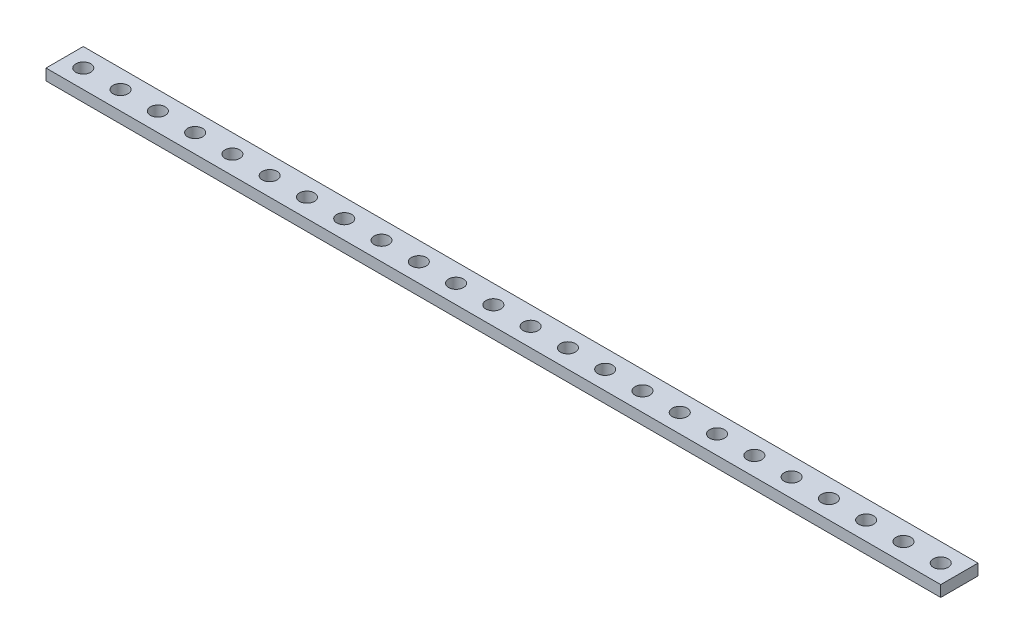
ISO-10303-21;
HEADER;
FILE_DESCRIPTION(('STEP AP214'),'2;1');
FILE_NAME('part.step','',(''),(''),'','','');
FILE_SCHEMA(('AUTOMOTIVE_DESIGN { 1 0 10303 214 1 1 1 1 }'));
ENDSEC;
DATA;
#1=APPLICATION_CONTEXT('core data for automotive mechanical design processes');
#2=APPLICATION_PROTOCOL_DEFINITION('international standard','automotive_design',2000,#1);
#3=PRODUCT_CONTEXT('',#1,'mechanical');
#4=PRODUCT('Part','Part','',(#3));
#5=PRODUCT_RELATED_PRODUCT_CATEGORY('part','',(#4));
#6=PRODUCT_DEFINITION_FORMATION('','',#4);
#7=PRODUCT_DEFINITION_CONTEXT('part definition',#1,'design');
#8=PRODUCT_DEFINITION('design','',#6,#7);
#9=PRODUCT_DEFINITION_SHAPE('','',#8);
#10=(LENGTH_UNIT() NAMED_UNIT(*) SI_UNIT(.MILLI.,.METRE.));
#11=(NAMED_UNIT(*) PLANE_ANGLE_UNIT() SI_UNIT($,.RADIAN.));
#12=(NAMED_UNIT(*) SI_UNIT($,.STERADIAN.) SOLID_ANGLE_UNIT());
#13=UNCERTAINTY_MEASURE_WITH_UNIT(LENGTH_MEASURE(1.E-05),#10,'distance_accuracy_value','');
#14=(GEOMETRIC_REPRESENTATION_CONTEXT(3) GLOBAL_UNCERTAINTY_ASSIGNED_CONTEXT((#13)) GLOBAL_UNIT_ASSIGNED_CONTEXT((#10,
#11,#12)) REPRESENTATION_CONTEXT('',''));
#15=CARTESIAN_POINT('',(0.,0.,0.));
#16=DIRECTION('',(0.,0.,1.));
#17=DIRECTION('',(1.,0.,0.));
#18=AXIS2_PLACEMENT_3D('',#15,#16,#17);
#19=CARTESIAN_POINT('',(0.,3.,0.));
#20=DIRECTION('',(0.,-1.,0.));
#21=DIRECTION('',(0.,0.,-1.));
#22=AXIS2_PLACEMENT_3D('',#19,#20,#21);
#23=PLANE('',#22);
#24=DIRECTION('',(1.,0.,0.));
#25=VECTOR('',#24,1.);
#26=CARTESIAN_POINT('',(0.,3.,0.));
#27=LINE('',#26,#25);
#28=CARTESIAN_POINT('',(-140.,3.,0.));
#29=VERTEX_POINT('',#28);
#30=CARTESIAN_POINT('',(100.,3.,0.));
#31=VERTEX_POINT('',#30);
#32=EDGE_CURVE('E89',#29,#31,#27,.T.);
#33=ORIENTED_EDGE('',*,*,#32,.T.);
#34=DIRECTION('',(0.,0.,1.));
#35=VECTOR('',#34,1.);
#36=CARTESIAN_POINT('',(100.,3.,-10.));
#37=LINE('',#36,#35);
#38=CARTESIAN_POINT('',(100.,3.,-10.));
#39=VERTEX_POINT('',#38);
#40=EDGE_CURVE('E244',#39,#31,#37,.T.);
#41=ORIENTED_EDGE('',*,*,#40,.F.);
#42=DIRECTION('',(-1.,0.,0.));
#43=VECTOR('',#42,1.);
#44=CARTESIAN_POINT('',(-140.,3.,-9.99999999999998));
#45=LINE('',#44,#43);
#46=CARTESIAN_POINT('',(-140.,3.,-9.99999999999998));
#47=VERTEX_POINT('',#46);
#48=EDGE_CURVE('E91',#39,#47,#45,.T.);
#49=ORIENTED_EDGE('',*,*,#48,.T.);
#50=DIRECTION('',(0.,0.,1.));
#51=VECTOR('',#50,1.);
#52=CARTESIAN_POINT('',(-140.,3.,0.));
#53=LINE('',#52,#51);
#54=EDGE_CURVE('E60',#47,#29,#53,.T.);
#55=ORIENTED_EDGE('',*,*,#54,.T.);
#56=EDGE_LOOP('',(#33,#41,#49,#55));
#57=FACE_BOUND('',#56,.T.);
#58=CARTESIAN_POINT('',(-135.,3.,-4.99999999999998));
#59=DIRECTION('',(0.,1.,0.));
#60=DIRECTION('',(0.,0.,1.));
#61=AXIS2_PLACEMENT_3D('',#58,#59,#60);
#62=CIRCLE('',#61,2.);
#63=CARTESIAN_POINT('',(-135.,3.,-2.99999999999999));
#64=VERTEX_POINT('',#63);
#65=EDGE_CURVE('E83',#64,#64,#62,.T.);
#66=ORIENTED_EDGE('',*,*,#65,.F.);
#67=EDGE_LOOP('',(#66));
#68=FACE_BOUND('',#67,.T.);
#69=CARTESIAN_POINT('',(-125.,3.,-4.99999999999998));
#70=DIRECTION('',(0.,1.,0.));
#71=DIRECTION('',(0.,0.,1.));
#72=AXIS2_PLACEMENT_3D('',#69,#70,#71);
#73=CIRCLE('',#72,1.99999999999998);
#74=CARTESIAN_POINT('',(-125.,3.,-3.));
#75=VERTEX_POINT('',#74);
#76=EDGE_CURVE('E100',#75,#75,#73,.T.);
#77=ORIENTED_EDGE('',*,*,#76,.F.);
#78=EDGE_LOOP('',(#77));
#79=FACE_BOUND('',#78,.T.);
#80=CARTESIAN_POINT('',(-115.,3.,-4.99999999999998));
#81=DIRECTION('',(0.,1.,0.));
#82=DIRECTION('',(0.,0.,1.));
#83=AXIS2_PLACEMENT_3D('',#80,#81,#82);
#84=CIRCLE('',#83,2.);
#85=CARTESIAN_POINT('',(-115.,3.,-2.99999999999999));
#86=VERTEX_POINT('',#85);
#87=EDGE_CURVE('E106',#86,#86,#84,.T.);
#88=ORIENTED_EDGE('',*,*,#87,.F.);
#89=EDGE_LOOP('',(#88));
#90=FACE_BOUND('',#89,.T.);
#91=CARTESIAN_POINT('',(-105.,3.,-4.99999999999998));
#92=DIRECTION('',(0.,1.,0.));
#93=DIRECTION('',(0.,0.,1.));
#94=AXIS2_PLACEMENT_3D('',#91,#92,#93);
#95=CIRCLE('',#94,2.);
#96=CARTESIAN_POINT('',(-105.,3.,-2.99999999999999));
#97=VERTEX_POINT('',#96);
#98=EDGE_CURVE('E112',#97,#97,#95,.T.);
#99=ORIENTED_EDGE('',*,*,#98,.F.);
#100=EDGE_LOOP('',(#99));
#101=FACE_BOUND('',#100,.T.);
#102=CARTESIAN_POINT('',(-95.,3.,-4.99999999999998));
#103=DIRECTION('',(0.,1.,0.));
#104=DIRECTION('',(0.,0.,1.));
#105=AXIS2_PLACEMENT_3D('',#102,#103,#104);
#106=CIRCLE('',#105,2.);
#107=CARTESIAN_POINT('',(-95.,3.,-2.99999999999999));
#108=VERTEX_POINT('',#107);
#109=EDGE_CURVE('E118',#108,#108,#106,.T.);
#110=ORIENTED_EDGE('',*,*,#109,.F.);
#111=EDGE_LOOP('',(#110));
#112=FACE_BOUND('',#111,.T.);
#113=CARTESIAN_POINT('',(-85.,3.,-4.99999999999998));
#114=DIRECTION('',(0.,1.,0.));
#115=DIRECTION('',(0.,0.,1.));
#116=AXIS2_PLACEMENT_3D('',#113,#114,#115);
#117=CIRCLE('',#116,2.);
#118=CARTESIAN_POINT('',(-85.,3.,-2.99999999999999));
#119=VERTEX_POINT('',#118);
#120=EDGE_CURVE('E124',#119,#119,#117,.T.);
#121=ORIENTED_EDGE('',*,*,#120,.F.);
#122=EDGE_LOOP('',(#121));
#123=FACE_BOUND('',#122,.T.);
#124=CARTESIAN_POINT('',(-75.,3.,-4.99999999999998));
#125=DIRECTION('',(0.,1.,0.));
#126=DIRECTION('',(0.,0.,1.));
#127=AXIS2_PLACEMENT_3D('',#124,#125,#126);
#128=CIRCLE('',#127,2.);
#129=CARTESIAN_POINT('',(-75.,3.,-2.99999999999999));
#130=VERTEX_POINT('',#129);
#131=EDGE_CURVE('E130',#130,#130,#128,.T.);
#132=ORIENTED_EDGE('',*,*,#131,.F.);
#133=EDGE_LOOP('',(#132));
#134=FACE_BOUND('',#133,.T.);
#135=CARTESIAN_POINT('',(-65.,3.,-4.99999999999998));
#136=DIRECTION('',(0.,1.,0.));
#137=DIRECTION('',(0.,0.,1.));
#138=AXIS2_PLACEMENT_3D('',#135,#136,#137);
#139=CIRCLE('',#138,2.);
#140=CARTESIAN_POINT('',(-65.,3.,-2.99999999999999));
#141=VERTEX_POINT('',#140);
#142=EDGE_CURVE('E136',#141,#141,#139,.T.);
#143=ORIENTED_EDGE('',*,*,#142,.F.);
#144=EDGE_LOOP('',(#143));
#145=FACE_BOUND('',#144,.T.);
#146=CARTESIAN_POINT('',(-55.,3.,-4.99999999999998));
#147=DIRECTION('',(0.,1.,0.));
#148=DIRECTION('',(0.,0.,1.));
#149=AXIS2_PLACEMENT_3D('',#146,#147,#148);
#150=CIRCLE('',#149,2.);
#151=CARTESIAN_POINT('',(-55.,3.,-2.99999999999999));
#152=VERTEX_POINT('',#151);
#153=EDGE_CURVE('E142',#152,#152,#150,.T.);
#154=ORIENTED_EDGE('',*,*,#153,.F.);
#155=EDGE_LOOP('',(#154));
#156=FACE_BOUND('',#155,.T.);
#157=CARTESIAN_POINT('',(-45.,3.,-4.99999999999998));
#158=DIRECTION('',(0.,1.,0.));
#159=DIRECTION('',(0.,0.,1.));
#160=AXIS2_PLACEMENT_3D('',#157,#158,#159);
#161=CIRCLE('',#160,2.);
#162=CARTESIAN_POINT('',(-45.,3.,-2.99999999999999));
#163=VERTEX_POINT('',#162);
#164=EDGE_CURVE('E148',#163,#163,#161,.T.);
#165=ORIENTED_EDGE('',*,*,#164,.F.);
#166=EDGE_LOOP('',(#165));
#167=FACE_BOUND('',#166,.T.);
#168=CARTESIAN_POINT('',(-35.,3.,-4.99999999999998));
#169=DIRECTION('',(0.,1.,0.));
#170=DIRECTION('',(0.,0.,1.));
#171=AXIS2_PLACEMENT_3D('',#168,#169,#170);
#172=CIRCLE('',#171,2.);
#173=CARTESIAN_POINT('',(-35.,3.,-2.99999999999999));
#174=VERTEX_POINT('',#173);
#175=EDGE_CURVE('E154',#174,#174,#172,.T.);
#176=ORIENTED_EDGE('',*,*,#175,.F.);
#177=EDGE_LOOP('',(#176));
#178=FACE_BOUND('',#177,.T.);
#179=CARTESIAN_POINT('',(-25.,3.,-4.99999999999998));
#180=DIRECTION('',(0.,1.,0.));
#181=DIRECTION('',(0.,0.,1.));
#182=AXIS2_PLACEMENT_3D('',#179,#180,#181);
#183=CIRCLE('',#182,2.);
#184=CARTESIAN_POINT('',(-25.,3.,-2.99999999999999));
#185=VERTEX_POINT('',#184);
#186=EDGE_CURVE('E160',#185,#185,#183,.T.);
#187=ORIENTED_EDGE('',*,*,#186,.F.);
#188=EDGE_LOOP('',(#187));
#189=FACE_BOUND('',#188,.T.);
#190=CARTESIAN_POINT('',(-15.,3.,-4.99999999999998));
#191=DIRECTION('',(0.,1.,0.));
#192=DIRECTION('',(0.,0.,1.));
#193=AXIS2_PLACEMENT_3D('',#190,#191,#192);
#194=CIRCLE('',#193,2.);
#195=CARTESIAN_POINT('',(-15.,3.,-2.99999999999999));
#196=VERTEX_POINT('',#195);
#197=EDGE_CURVE('E166',#196,#196,#194,.T.);
#198=ORIENTED_EDGE('',*,*,#197,.F.);
#199=EDGE_LOOP('',(#198));
#200=FACE_BOUND('',#199,.T.);
#201=CARTESIAN_POINT('',(-5.,3.,-4.99999999999998));
#202=DIRECTION('',(0.,1.,0.));
#203=DIRECTION('',(0.,0.,1.));
#204=AXIS2_PLACEMENT_3D('',#201,#202,#203);
#205=CIRCLE('',#204,2.);
#206=CARTESIAN_POINT('',(-5.,3.,-2.99999999999999));
#207=VERTEX_POINT('',#206);
#208=EDGE_CURVE('E172',#207,#207,#205,.T.);
#209=ORIENTED_EDGE('',*,*,#208,.F.);
#210=EDGE_LOOP('',(#209));
#211=FACE_BOUND('',#210,.T.);
#212=CARTESIAN_POINT('',(5.,3.,-4.99999999999998));
#213=DIRECTION('',(0.,1.,0.));
#214=DIRECTION('',(0.,0.,1.));
#215=AXIS2_PLACEMENT_3D('',#212,#213,#214);
#216=CIRCLE('',#215,2.);
#217=CARTESIAN_POINT('',(5.,3.,-2.99999999999999));
#218=VERTEX_POINT('',#217);
#219=EDGE_CURVE('E178',#218,#218,#216,.T.);
#220=ORIENTED_EDGE('',*,*,#219,.F.);
#221=EDGE_LOOP('',(#220));
#222=FACE_BOUND('',#221,.T.);
#223=CARTESIAN_POINT('',(15.,3.,-4.99999999999998));
#224=DIRECTION('',(0.,1.,0.));
#225=DIRECTION('',(0.,0.,1.));
#226=AXIS2_PLACEMENT_3D('',#223,#224,#225);
#227=CIRCLE('',#226,2.);
#228=CARTESIAN_POINT('',(15.,3.,-2.99999999999999));
#229=VERTEX_POINT('',#228);
#230=EDGE_CURVE('E184',#229,#229,#227,.T.);
#231=ORIENTED_EDGE('',*,*,#230,.F.);
#232=EDGE_LOOP('',(#231));
#233=FACE_BOUND('',#232,.T.);
#234=CARTESIAN_POINT('',(25.,3.,-4.99999999999998));
#235=DIRECTION('',(0.,1.,0.));
#236=DIRECTION('',(0.,0.,1.));
#237=AXIS2_PLACEMENT_3D('',#234,#235,#236);
#238=CIRCLE('',#237,2.);
#239=CARTESIAN_POINT('',(25.,3.,-2.99999999999999));
#240=VERTEX_POINT('',#239);
#241=EDGE_CURVE('E190',#240,#240,#238,.T.);
#242=ORIENTED_EDGE('',*,*,#241,.F.);
#243=EDGE_LOOP('',(#242));
#244=FACE_BOUND('',#243,.T.);
#245=CARTESIAN_POINT('',(35.,3.,-4.99999999999998));
#246=DIRECTION('',(0.,1.,0.));
#247=DIRECTION('',(0.,0.,1.));
#248=AXIS2_PLACEMENT_3D('',#245,#246,#247);
#249=CIRCLE('',#248,2.);
#250=CARTESIAN_POINT('',(35.,3.,-2.99999999999999));
#251=VERTEX_POINT('',#250);
#252=EDGE_CURVE('E196',#251,#251,#249,.T.);
#253=ORIENTED_EDGE('',*,*,#252,.F.);
#254=EDGE_LOOP('',(#253));
#255=FACE_BOUND('',#254,.T.);
#256=CARTESIAN_POINT('',(45.,3.,-4.99999999999998));
#257=DIRECTION('',(0.,1.,0.));
#258=DIRECTION('',(0.,0.,1.));
#259=AXIS2_PLACEMENT_3D('',#256,#257,#258);
#260=CIRCLE('',#259,2.);
#261=CARTESIAN_POINT('',(45.,3.,-2.99999999999999));
#262=VERTEX_POINT('',#261);
#263=EDGE_CURVE('E202',#262,#262,#260,.T.);
#264=ORIENTED_EDGE('',*,*,#263,.F.);
#265=EDGE_LOOP('',(#264));
#266=FACE_BOUND('',#265,.T.);
#267=CARTESIAN_POINT('',(55.,3.,-4.99999999999998));
#268=DIRECTION('',(0.,1.,0.));
#269=DIRECTION('',(0.,0.,1.));
#270=AXIS2_PLACEMENT_3D('',#267,#268,#269);
#271=CIRCLE('',#270,2.);
#272=CARTESIAN_POINT('',(55.,3.,-2.99999999999999));
#273=VERTEX_POINT('',#272);
#274=EDGE_CURVE('E208',#273,#273,#271,.T.);
#275=ORIENTED_EDGE('',*,*,#274,.F.);
#276=EDGE_LOOP('',(#275));
#277=FACE_BOUND('',#276,.T.);
#278=CARTESIAN_POINT('',(65.,3.,-4.99999999999998));
#279=DIRECTION('',(0.,1.,0.));
#280=DIRECTION('',(0.,0.,1.));
#281=AXIS2_PLACEMENT_3D('',#278,#279,#280);
#282=CIRCLE('',#281,2.);
#283=CARTESIAN_POINT('',(65.,3.,-2.99999999999999));
#284=VERTEX_POINT('',#283);
#285=EDGE_CURVE('E214',#284,#284,#282,.T.);
#286=ORIENTED_EDGE('',*,*,#285,.F.);
#287=EDGE_LOOP('',(#286));
#288=FACE_BOUND('',#287,.T.);
#289=CARTESIAN_POINT('',(75.,3.,-4.99999999999998));
#290=DIRECTION('',(0.,1.,0.));
#291=DIRECTION('',(0.,0.,1.));
#292=AXIS2_PLACEMENT_3D('',#289,#290,#291);
#293=CIRCLE('',#292,2.);
#294=CARTESIAN_POINT('',(75.,3.,-2.99999999999999));
#295=VERTEX_POINT('',#294);
#296=EDGE_CURVE('E220',#295,#295,#293,.T.);
#297=ORIENTED_EDGE('',*,*,#296,.F.);
#298=EDGE_LOOP('',(#297));
#299=FACE_BOUND('',#298,.T.);
#300=CARTESIAN_POINT('',(85.,3.,-4.99999999999998));
#301=DIRECTION('',(0.,1.,0.));
#302=DIRECTION('',(0.,0.,1.));
#303=AXIS2_PLACEMENT_3D('',#300,#301,#302);
#304=CIRCLE('',#303,2.);
#305=CARTESIAN_POINT('',(85.,3.,-2.99999999999999));
#306=VERTEX_POINT('',#305);
#307=EDGE_CURVE('E226',#306,#306,#304,.T.);
#308=ORIENTED_EDGE('',*,*,#307,.F.);
#309=EDGE_LOOP('',(#308));
#310=FACE_BOUND('',#309,.T.);
#311=CARTESIAN_POINT('',(95.,3.,-4.99999999999998));
#312=DIRECTION('',(0.,1.,0.));
#313=DIRECTION('',(0.,0.,1.));
#314=AXIS2_PLACEMENT_3D('',#311,#312,#313);
#315=CIRCLE('',#314,2.);
#316=CARTESIAN_POINT('',(95.,3.,-2.99999999999999));
#317=VERTEX_POINT('',#316);
#318=EDGE_CURVE('E232',#317,#317,#315,.T.);
#319=ORIENTED_EDGE('',*,*,#318,.F.);
#320=EDGE_LOOP('',(#319));
#321=FACE_BOUND('',#320,.T.);
#322=ADVANCED_FACE('F36',(#57,#68,#79,#90,#101,#112,#123,#134,#145,#156,#167,#178,#189,#200,
#211,#222,#233,#244,#255,#266,#277,#288,#299,#310,#321),#23,.F.);
#323=CARTESIAN_POINT('',(0.,0.,0.));
#324=DIRECTION('',(0.,-1.,0.));
#325=DIRECTION('',(0.,0.,-1.));
#326=AXIS2_PLACEMENT_3D('',#323,#324,#325);
#327=PLANE('',#326);
#328=DIRECTION('',(0.,0.,1.));
#329=VECTOR('',#328,1.);
#330=CARTESIAN_POINT('',(100.,0.,-10.));
#331=LINE('',#330,#329);
#332=CARTESIAN_POINT('',(100.,0.,-9.99999999999998));
#333=VERTEX_POINT('',#332);
#334=CARTESIAN_POINT('',(100.,0.,0.));
#335=VERTEX_POINT('',#334);
#336=EDGE_CURVE('E51',#333,#335,#331,.T.);
#337=ORIENTED_EDGE('',*,*,#336,.T.);
#338=DIRECTION('',(1.,0.,0.));
#339=VECTOR('',#338,1.);
#340=CARTESIAN_POINT('',(0.,0.,0.));
#341=LINE('',#340,#339);
#342=CARTESIAN_POINT('',(-140.,0.,0.));
#343=VERTEX_POINT('',#342);
#344=EDGE_CURVE('E73',#343,#335,#341,.T.);
#345=ORIENTED_EDGE('',*,*,#344,.F.);
#346=DIRECTION('',(0.,0.,1.));
#347=VECTOR('',#346,1.);
#348=CARTESIAN_POINT('',(-140.,0.,0.));
#349=LINE('',#348,#347);
#350=CARTESIAN_POINT('',(-140.,0.,-9.99999999999998));
#351=VERTEX_POINT('',#350);
#352=EDGE_CURVE('E78',#351,#343,#349,.T.);
#353=ORIENTED_EDGE('',*,*,#352,.F.);
#354=DIRECTION('',(-1.,0.,0.));
#355=VECTOR('',#354,1.);
#356=CARTESIAN_POINT('',(-140.,0.,-9.99999999999998));
#357=LINE('',#356,#355);
#358=EDGE_CURVE('E82',#333,#351,#357,.T.);
#359=ORIENTED_EDGE('',*,*,#358,.F.);
#360=EDGE_LOOP('',(#337,#345,#353,#359));
#361=FACE_BOUND('',#360,.T.);
#362=CARTESIAN_POINT('',(85.,0.,-4.99999999999998));
#363=DIRECTION('',(0.,1.,0.));
#364=DIRECTION('',(0.,0.,1.));
#365=AXIS2_PLACEMENT_3D('',#362,#363,#364);
#366=CIRCLE('',#365,2.);
#367=CARTESIAN_POINT('',(85.,0.,-2.99999999999999));
#368=VERTEX_POINT('',#367);
#369=EDGE_CURVE('E229',#368,#368,#366,.T.);
#370=ORIENTED_EDGE('',*,*,#369,.T.);
#371=EDGE_LOOP('',(#370));
#372=FACE_BOUND('',#371,.T.);
#373=CARTESIAN_POINT('',(65.,0.,-4.99999999999998));
#374=DIRECTION('',(0.,1.,0.));
#375=DIRECTION('',(0.,0.,1.));
#376=AXIS2_PLACEMENT_3D('',#373,#374,#375);
#377=CIRCLE('',#376,2.);
#378=CARTESIAN_POINT('',(65.,0.,-2.99999999999999));
#379=VERTEX_POINT('',#378);
#380=EDGE_CURVE('E217',#379,#379,#377,.T.);
#381=ORIENTED_EDGE('',*,*,#380,.T.);
#382=EDGE_LOOP('',(#381));
#383=FACE_BOUND('',#382,.T.);
#384=CARTESIAN_POINT('',(45.,0.,-4.99999999999998));
#385=DIRECTION('',(0.,1.,0.));
#386=DIRECTION('',(0.,0.,1.));
#387=AXIS2_PLACEMENT_3D('',#384,#385,#386);
#388=CIRCLE('',#387,2.);
#389=CARTESIAN_POINT('',(45.,0.,-2.99999999999999));
#390=VERTEX_POINT('',#389);
#391=EDGE_CURVE('E205',#390,#390,#388,.T.);
#392=ORIENTED_EDGE('',*,*,#391,.T.);
#393=EDGE_LOOP('',(#392));
#394=FACE_BOUND('',#393,.T.);
#395=CARTESIAN_POINT('',(25.,0.,-4.99999999999998));
#396=DIRECTION('',(0.,1.,0.));
#397=DIRECTION('',(0.,0.,1.));
#398=AXIS2_PLACEMENT_3D('',#395,#396,#397);
#399=CIRCLE('',#398,2.);
#400=CARTESIAN_POINT('',(25.,0.,-2.99999999999999));
#401=VERTEX_POINT('',#400);
#402=EDGE_CURVE('E193',#401,#401,#399,.T.);
#403=ORIENTED_EDGE('',*,*,#402,.T.);
#404=EDGE_LOOP('',(#403));
#405=FACE_BOUND('',#404,.T.);
#406=CARTESIAN_POINT('',(5.,0.,-4.99999999999998));
#407=DIRECTION('',(0.,1.,0.));
#408=DIRECTION('',(0.,0.,1.));
#409=AXIS2_PLACEMENT_3D('',#406,#407,#408);
#410=CIRCLE('',#409,2.);
#411=CARTESIAN_POINT('',(5.,0.,-2.99999999999999));
#412=VERTEX_POINT('',#411);
#413=EDGE_CURVE('E181',#412,#412,#410,.T.);
#414=ORIENTED_EDGE('',*,*,#413,.T.);
#415=EDGE_LOOP('',(#414));
#416=FACE_BOUND('',#415,.T.);
#417=CARTESIAN_POINT('',(-15.,0.,-4.99999999999998));
#418=DIRECTION('',(0.,1.,0.));
#419=DIRECTION('',(0.,0.,1.));
#420=AXIS2_PLACEMENT_3D('',#417,#418,#419);
#421=CIRCLE('',#420,2.);
#422=CARTESIAN_POINT('',(-15.,0.,-2.99999999999999));
#423=VERTEX_POINT('',#422);
#424=EDGE_CURVE('E169',#423,#423,#421,.T.);
#425=ORIENTED_EDGE('',*,*,#424,.T.);
#426=EDGE_LOOP('',(#425));
#427=FACE_BOUND('',#426,.T.);
#428=CARTESIAN_POINT('',(-35.,0.,-4.99999999999998));
#429=DIRECTION('',(0.,1.,0.));
#430=DIRECTION('',(0.,0.,1.));
#431=AXIS2_PLACEMENT_3D('',#428,#429,#430);
#432=CIRCLE('',#431,2.);
#433=CARTESIAN_POINT('',(-35.,0.,-2.99999999999999));
#434=VERTEX_POINT('',#433);
#435=EDGE_CURVE('E157',#434,#434,#432,.T.);
#436=ORIENTED_EDGE('',*,*,#435,.T.);
#437=EDGE_LOOP('',(#436));
#438=FACE_BOUND('',#437,.T.);
#439=CARTESIAN_POINT('',(-55.,0.,-4.99999999999998));
#440=DIRECTION('',(0.,1.,0.));
#441=DIRECTION('',(0.,0.,1.));
#442=AXIS2_PLACEMENT_3D('',#439,#440,#441);
#443=CIRCLE('',#442,2.);
#444=CARTESIAN_POINT('',(-55.,0.,-2.99999999999999));
#445=VERTEX_POINT('',#444);
#446=EDGE_CURVE('E145',#445,#445,#443,.T.);
#447=ORIENTED_EDGE('',*,*,#446,.T.);
#448=EDGE_LOOP('',(#447));
#449=FACE_BOUND('',#448,.T.);
#450=CARTESIAN_POINT('',(-75.,0.,-4.99999999999998));
#451=DIRECTION('',(0.,1.,0.));
#452=DIRECTION('',(0.,0.,1.));
#453=AXIS2_PLACEMENT_3D('',#450,#451,#452);
#454=CIRCLE('',#453,2.);
#455=CARTESIAN_POINT('',(-75.,0.,-2.99999999999999));
#456=VERTEX_POINT('',#455);
#457=EDGE_CURVE('E133',#456,#456,#454,.T.);
#458=ORIENTED_EDGE('',*,*,#457,.T.);
#459=EDGE_LOOP('',(#458));
#460=FACE_BOUND('',#459,.T.);
#461=CARTESIAN_POINT('',(-95.,0.,-4.99999999999998));
#462=DIRECTION('',(0.,1.,0.));
#463=DIRECTION('',(0.,0.,1.));
#464=AXIS2_PLACEMENT_3D('',#461,#462,#463);
#465=CIRCLE('',#464,2.);
#466=CARTESIAN_POINT('',(-95.,0.,-2.99999999999999));
#467=VERTEX_POINT('',#466);
#468=EDGE_CURVE('E121',#467,#467,#465,.T.);
#469=ORIENTED_EDGE('',*,*,#468,.T.);
#470=EDGE_LOOP('',(#469));
#471=FACE_BOUND('',#470,.T.);
#472=CARTESIAN_POINT('',(-115.,0.,-4.99999999999998));
#473=DIRECTION('',(0.,1.,0.));
#474=DIRECTION('',(0.,0.,1.));
#475=AXIS2_PLACEMENT_3D('',#472,#473,#474);
#476=CIRCLE('',#475,2.);
#477=CARTESIAN_POINT('',(-115.,0.,-2.99999999999999));
#478=VERTEX_POINT('',#477);
#479=EDGE_CURVE('E109',#478,#478,#476,.T.);
#480=ORIENTED_EDGE('',*,*,#479,.T.);
#481=EDGE_LOOP('',(#480));
#482=FACE_BOUND('',#481,.T.);
#483=CARTESIAN_POINT('',(-135.,0.,-4.99999999999998));
#484=DIRECTION('',(0.,1.,0.));
#485=DIRECTION('',(0.,0.,1.));
#486=AXIS2_PLACEMENT_3D('',#483,#484,#485);
#487=CIRCLE('',#486,2.);
#488=CARTESIAN_POINT('',(-135.,0.,-2.99999999999999));
#489=VERTEX_POINT('',#488);
#490=EDGE_CURVE('E97',#489,#489,#487,.T.);
#491=ORIENTED_EDGE('',*,*,#490,.T.);
#492=EDGE_LOOP('',(#491));
#493=FACE_BOUND('',#492,.T.);
#494=CARTESIAN_POINT('',(-125.,0.,-4.99999999999998));
#495=DIRECTION('',(0.,1.,0.));
#496=DIRECTION('',(0.,0.,1.));
#497=AXIS2_PLACEMENT_3D('',#494,#495,#496);
#498=CIRCLE('',#497,1.99999999999998);
#499=CARTESIAN_POINT('',(-125.,0.,-3.));
#500=VERTEX_POINT('',#499);
#501=EDGE_CURVE('E103',#500,#500,#498,.T.);
#502=ORIENTED_EDGE('',*,*,#501,.T.);
#503=EDGE_LOOP('',(#502));
#504=FACE_BOUND('',#503,.T.);
#505=CARTESIAN_POINT('',(-105.,0.,-4.99999999999998));
#506=DIRECTION('',(0.,1.,0.));
#507=DIRECTION('',(0.,0.,1.));
#508=AXIS2_PLACEMENT_3D('',#505,#506,#507);
#509=CIRCLE('',#508,2.);
#510=CARTESIAN_POINT('',(-105.,0.,-2.99999999999999));
#511=VERTEX_POINT('',#510);
#512=EDGE_CURVE('E115',#511,#511,#509,.T.);
#513=ORIENTED_EDGE('',*,*,#512,.T.);
#514=EDGE_LOOP('',(#513));
#515=FACE_BOUND('',#514,.T.);
#516=CARTESIAN_POINT('',(-85.,0.,-4.99999999999998));
#517=DIRECTION('',(0.,1.,0.));
#518=DIRECTION('',(0.,0.,1.));
#519=AXIS2_PLACEMENT_3D('',#516,#517,#518);
#520=CIRCLE('',#519,2.);
#521=CARTESIAN_POINT('',(-85.,0.,-2.99999999999999));
#522=VERTEX_POINT('',#521);
#523=EDGE_CURVE('E127',#522,#522,#520,.T.);
#524=ORIENTED_EDGE('',*,*,#523,.T.);
#525=EDGE_LOOP('',(#524));
#526=FACE_BOUND('',#525,.T.);
#527=CARTESIAN_POINT('',(-65.,0.,-4.99999999999998));
#528=DIRECTION('',(0.,1.,0.));
#529=DIRECTION('',(0.,0.,1.));
#530=AXIS2_PLACEMENT_3D('',#527,#528,#529);
#531=CIRCLE('',#530,2.);
#532=CARTESIAN_POINT('',(-65.,0.,-2.99999999999999));
#533=VERTEX_POINT('',#532);
#534=EDGE_CURVE('E139',#533,#533,#531,.T.);
#535=ORIENTED_EDGE('',*,*,#534,.T.);
#536=EDGE_LOOP('',(#535));
#537=FACE_BOUND('',#536,.T.);
#538=CARTESIAN_POINT('',(-45.,0.,-4.99999999999998));
#539=DIRECTION('',(0.,1.,0.));
#540=DIRECTION('',(0.,0.,1.));
#541=AXIS2_PLACEMENT_3D('',#538,#539,#540);
#542=CIRCLE('',#541,2.);
#543=CARTESIAN_POINT('',(-45.,0.,-2.99999999999999));
#544=VERTEX_POINT('',#543);
#545=EDGE_CURVE('E151',#544,#544,#542,.T.);
#546=ORIENTED_EDGE('',*,*,#545,.T.);
#547=EDGE_LOOP('',(#546));
#548=FACE_BOUND('',#547,.T.);
#549=CARTESIAN_POINT('',(-25.,0.,-4.99999999999998));
#550=DIRECTION('',(0.,1.,0.));
#551=DIRECTION('',(0.,0.,1.));
#552=AXIS2_PLACEMENT_3D('',#549,#550,#551);
#553=CIRCLE('',#552,2.);
#554=CARTESIAN_POINT('',(-25.,0.,-2.99999999999999));
#555=VERTEX_POINT('',#554);
#556=EDGE_CURVE('E163',#555,#555,#553,.T.);
#557=ORIENTED_EDGE('',*,*,#556,.T.);
#558=EDGE_LOOP('',(#557));
#559=FACE_BOUND('',#558,.T.);
#560=CARTESIAN_POINT('',(-5.,0.,-4.99999999999998));
#561=DIRECTION('',(0.,1.,0.));
#562=DIRECTION('',(0.,0.,1.));
#563=AXIS2_PLACEMENT_3D('',#560,#561,#562);
#564=CIRCLE('',#563,2.);
#565=CARTESIAN_POINT('',(-5.,0.,-2.99999999999999));
#566=VERTEX_POINT('',#565);
#567=EDGE_CURVE('E175',#566,#566,#564,.T.);
#568=ORIENTED_EDGE('',*,*,#567,.T.);
#569=EDGE_LOOP('',(#568));
#570=FACE_BOUND('',#569,.T.);
#571=CARTESIAN_POINT('',(15.,0.,-4.99999999999998));
#572=DIRECTION('',(0.,1.,0.));
#573=DIRECTION('',(0.,0.,1.));
#574=AXIS2_PLACEMENT_3D('',#571,#572,#573);
#575=CIRCLE('',#574,2.);
#576=CARTESIAN_POINT('',(15.,0.,-2.99999999999999));
#577=VERTEX_POINT('',#576);
#578=EDGE_CURVE('E187',#577,#577,#575,.T.);
#579=ORIENTED_EDGE('',*,*,#578,.T.);
#580=EDGE_LOOP('',(#579));
#581=FACE_BOUND('',#580,.T.);
#582=CARTESIAN_POINT('',(35.,0.,-4.99999999999998));
#583=DIRECTION('',(0.,1.,0.));
#584=DIRECTION('',(0.,0.,1.));
#585=AXIS2_PLACEMENT_3D('',#582,#583,#584);
#586=CIRCLE('',#585,2.);
#587=CARTESIAN_POINT('',(35.,0.,-2.99999999999999));
#588=VERTEX_POINT('',#587);
#589=EDGE_CURVE('E199',#588,#588,#586,.T.);
#590=ORIENTED_EDGE('',*,*,#589,.T.);
#591=EDGE_LOOP('',(#590));
#592=FACE_BOUND('',#591,.T.);
#593=CARTESIAN_POINT('',(55.,0.,-4.99999999999998));
#594=DIRECTION('',(0.,1.,0.));
#595=DIRECTION('',(0.,0.,1.));
#596=AXIS2_PLACEMENT_3D('',#593,#594,#595);
#597=CIRCLE('',#596,2.);
#598=CARTESIAN_POINT('',(55.,0.,-2.99999999999999));
#599=VERTEX_POINT('',#598);
#600=EDGE_CURVE('E211',#599,#599,#597,.T.);
#601=ORIENTED_EDGE('',*,*,#600,.T.);
#602=EDGE_LOOP('',(#601));
#603=FACE_BOUND('',#602,.T.);
#604=CARTESIAN_POINT('',(75.,0.,-4.99999999999998));
#605=DIRECTION('',(0.,1.,0.));
#606=DIRECTION('',(0.,0.,1.));
#607=AXIS2_PLACEMENT_3D('',#604,#605,#606);
#608=CIRCLE('',#607,2.);
#609=CARTESIAN_POINT('',(75.,0.,-2.99999999999999));
#610=VERTEX_POINT('',#609);
#611=EDGE_CURVE('E223',#610,#610,#608,.T.);
#612=ORIENTED_EDGE('',*,*,#611,.T.);
#613=EDGE_LOOP('',(#612));
#614=FACE_BOUND('',#613,.T.);
#615=CARTESIAN_POINT('',(95.,0.,-4.99999999999998));
#616=DIRECTION('',(0.,1.,0.));
#617=DIRECTION('',(0.,0.,1.));
#618=AXIS2_PLACEMENT_3D('',#615,#616,#617);
#619=CIRCLE('',#618,2.);
#620=CARTESIAN_POINT('',(95.,0.,-2.99999999999999));
#621=VERTEX_POINT('',#620);
#622=EDGE_CURVE('E235',#621,#621,#619,.T.);
#623=ORIENTED_EDGE('',*,*,#622,.T.);
#624=EDGE_LOOP('',(#623));
#625=FACE_BOUND('',#624,.T.);
#626=ADVANCED_FACE('F75',(#361,#372,#383,#394,#405,#416,#427,#438,#449,#460,#471,#482,#493,#504,
#515,#526,#537,#548,#559,#570,#581,#592,#603,#614,#625),#327,.T.);
#627=CARTESIAN_POINT('',(0.,3.,0.));
#628=DIRECTION('',(0.,0.,-1.));
#629=DIRECTION('',(-1.,0.,0.));
#630=AXIS2_PLACEMENT_3D('',#627,#628,#629);
#631=PLANE('',#630);
#632=ORIENTED_EDGE('',*,*,#344,.T.);
#633=DIRECTION('',(0.,1.,0.));
#634=VECTOR('',#633,1.);
#635=CARTESIAN_POINT('',(100.,-0.00100000000000013,0.));
#636=LINE('',#635,#634);
#637=EDGE_CURVE('E241',#335,#31,#636,.T.);
#638=ORIENTED_EDGE('',*,*,#637,.T.);
#639=ORIENTED_EDGE('',*,*,#32,.F.);
#640=DIRECTION('',(0.,-1.,0.));
#641=VECTOR('',#640,1.);
#642=CARTESIAN_POINT('',(-140.,3.,0.));
#643=LINE('',#642,#641);
#644=EDGE_CURVE('E44',#29,#343,#643,.T.);
#645=ORIENTED_EDGE('',*,*,#644,.T.);
#646=EDGE_LOOP('',(#632,#638,#639,#645));
#647=FACE_BOUND('',#646,.T.);
#648=ADVANCED_FACE('F38',(#647),#631,.F.);
#649=CARTESIAN_POINT('',(-140.,3.,-9.99999999999998));
#650=DIRECTION('',(0.,0.,1.));
#651=DIRECTION('',(1.,0.,0.));
#652=AXIS2_PLACEMENT_3D('',#649,#650,#651);
#653=PLANE('',#652);
#654=ORIENTED_EDGE('',*,*,#48,.F.);
#655=DIRECTION('',(0.,1.,0.));
#656=VECTOR('',#655,1.);
#657=CARTESIAN_POINT('',(100.,-0.00100000000000013,-10.));
#658=LINE('',#657,#656);
#659=EDGE_CURVE('E242',#333,#39,#658,.T.);
#660=ORIENTED_EDGE('',*,*,#659,.F.);
#661=ORIENTED_EDGE('',*,*,#358,.T.);
#662=DIRECTION('',(0.,-1.,0.));
#663=VECTOR('',#662,1.);
#664=CARTESIAN_POINT('',(-140.,3.,-9.99999999999998));
#665=LINE('',#664,#663);
#666=EDGE_CURVE('E11',#47,#351,#665,.T.);
#667=ORIENTED_EDGE('',*,*,#666,.F.);
#668=EDGE_LOOP('',(#654,#660,#661,#667));
#669=FACE_BOUND('',#668,.T.);
#670=ADVANCED_FACE('F316',(#669),#653,.F.);
#671=CARTESIAN_POINT('',(-140.,3.,0.));
#672=DIRECTION('',(1.,0.,0.));
#673=DIRECTION('',(0.,0.,-1.));
#674=AXIS2_PLACEMENT_3D('',#671,#672,#673);
#675=PLANE('',#674);
#676=ORIENTED_EDGE('',*,*,#352,.T.);
#677=ORIENTED_EDGE('',*,*,#644,.F.);
#678=ORIENTED_EDGE('',*,*,#54,.F.);
#679=ORIENTED_EDGE('',*,*,#666,.T.);
#680=EDGE_LOOP('',(#676,#677,#678,#679));
#681=FACE_BOUND('',#680,.T.);
#682=ADVANCED_FACE('F86',(#681),#675,.F.);
#683=CARTESIAN_POINT('',(-135.,3.,-4.99999999999998));
#684=DIRECTION('',(0.,-1.,0.));
#685=DIRECTION('',(0.,0.,-1.));
#686=AXIS2_PLACEMENT_3D('',#683,#684,#685);
#687=CYLINDRICAL_SURFACE('',#686,2.);
#688=ORIENTED_EDGE('',*,*,#65,.T.);
#689=EDGE_LOOP('',(#688));
#690=FACE_BOUND('',#689,.T.);
#691=ORIENTED_EDGE('',*,*,#490,.F.);
#692=EDGE_LOOP('',(#691));
#693=FACE_BOUND('',#692,.T.);
#694=ADVANCED_FACE('F320',(#690,#693),#687,.F.);
#695=CARTESIAN_POINT('',(-125.,3.,-4.99999999999998));
#696=DIRECTION('',(0.,-1.,0.));
#697=DIRECTION('',(0.,0.,-1.));
#698=AXIS2_PLACEMENT_3D('',#695,#696,#697);
#699=CYLINDRICAL_SURFACE('',#698,1.99999999999998);
#700=ORIENTED_EDGE('',*,*,#76,.T.);
#701=EDGE_LOOP('',(#700));
#702=FACE_BOUND('',#701,.T.);
#703=ORIENTED_EDGE('',*,*,#501,.F.);
#704=EDGE_LOOP('',(#703));
#705=FACE_BOUND('',#704,.T.);
#706=ADVANCED_FACE('F506',(#702,#705),#699,.F.);
#707=CARTESIAN_POINT('',(-115.,3.,-4.99999999999998));
#708=DIRECTION('',(0.,-1.,0.));
#709=DIRECTION('',(0.,0.,-1.));
#710=AXIS2_PLACEMENT_3D('',#707,#708,#709);
#711=CYLINDRICAL_SURFACE('',#710,2.);
#712=ORIENTED_EDGE('',*,*,#87,.T.);
#713=EDGE_LOOP('',(#712));
#714=FACE_BOUND('',#713,.T.);
#715=ORIENTED_EDGE('',*,*,#479,.F.);
#716=EDGE_LOOP('',(#715));
#717=FACE_BOUND('',#716,.T.);
#718=ADVANCED_FACE('F498',(#714,#717),#711,.F.);
#719=CARTESIAN_POINT('',(-105.,3.,-4.99999999999998));
#720=DIRECTION('',(0.,-1.,0.));
#721=DIRECTION('',(0.,0.,-1.));
#722=AXIS2_PLACEMENT_3D('',#719,#720,#721);
#723=CYLINDRICAL_SURFACE('',#722,2.);
#724=ORIENTED_EDGE('',*,*,#98,.T.);
#725=EDGE_LOOP('',(#724));
#726=FACE_BOUND('',#725,.T.);
#727=ORIENTED_EDGE('',*,*,#512,.F.);
#728=EDGE_LOOP('',(#727));
#729=FACE_BOUND('',#728,.T.);
#730=ADVANCED_FACE('F490',(#726,#729),#723,.F.);
#731=CARTESIAN_POINT('',(-95.,3.,-4.99999999999998));
#732=DIRECTION('',(0.,-1.,0.));
#733=DIRECTION('',(0.,0.,-1.));
#734=AXIS2_PLACEMENT_3D('',#731,#732,#733);
#735=CYLINDRICAL_SURFACE('',#734,2.);
#736=ORIENTED_EDGE('',*,*,#109,.T.);
#737=EDGE_LOOP('',(#736));
#738=FACE_BOUND('',#737,.T.);
#739=ORIENTED_EDGE('',*,*,#468,.F.);
#740=EDGE_LOOP('',(#739));
#741=FACE_BOUND('',#740,.T.);
#742=ADVANCED_FACE('F482',(#738,#741),#735,.F.);
#743=CARTESIAN_POINT('',(-85.,3.,-4.99999999999998));
#744=DIRECTION('',(0.,-1.,0.));
#745=DIRECTION('',(0.,0.,-1.));
#746=AXIS2_PLACEMENT_3D('',#743,#744,#745);
#747=CYLINDRICAL_SURFACE('',#746,2.);
#748=ORIENTED_EDGE('',*,*,#120,.T.);
#749=EDGE_LOOP('',(#748));
#750=FACE_BOUND('',#749,.T.);
#751=ORIENTED_EDGE('',*,*,#523,.F.);
#752=EDGE_LOOP('',(#751));
#753=FACE_BOUND('',#752,.T.);
#754=ADVANCED_FACE('F474',(#750,#753),#747,.F.);
#755=CARTESIAN_POINT('',(-75.,3.,-4.99999999999998));
#756=DIRECTION('',(0.,-1.,0.));
#757=DIRECTION('',(0.,0.,-1.));
#758=AXIS2_PLACEMENT_3D('',#755,#756,#757);
#759=CYLINDRICAL_SURFACE('',#758,2.);
#760=ORIENTED_EDGE('',*,*,#131,.T.);
#761=EDGE_LOOP('',(#760));
#762=FACE_BOUND('',#761,.T.);
#763=ORIENTED_EDGE('',*,*,#457,.F.);
#764=EDGE_LOOP('',(#763));
#765=FACE_BOUND('',#764,.T.);
#766=ADVANCED_FACE('F466',(#762,#765),#759,.F.);
#767=CARTESIAN_POINT('',(-65.,3.,-4.99999999999998));
#768=DIRECTION('',(0.,-1.,0.));
#769=DIRECTION('',(0.,0.,-1.));
#770=AXIS2_PLACEMENT_3D('',#767,#768,#769);
#771=CYLINDRICAL_SURFACE('',#770,2.);
#772=ORIENTED_EDGE('',*,*,#142,.T.);
#773=EDGE_LOOP('',(#772));
#774=FACE_BOUND('',#773,.T.);
#775=ORIENTED_EDGE('',*,*,#534,.F.);
#776=EDGE_LOOP('',(#775));
#777=FACE_BOUND('',#776,.T.);
#778=ADVANCED_FACE('F458',(#774,#777),#771,.F.);
#779=CARTESIAN_POINT('',(-55.,3.,-4.99999999999998));
#780=DIRECTION('',(0.,-1.,0.));
#781=DIRECTION('',(0.,0.,-1.));
#782=AXIS2_PLACEMENT_3D('',#779,#780,#781);
#783=CYLINDRICAL_SURFACE('',#782,2.);
#784=ORIENTED_EDGE('',*,*,#153,.T.);
#785=EDGE_LOOP('',(#784));
#786=FACE_BOUND('',#785,.T.);
#787=ORIENTED_EDGE('',*,*,#446,.F.);
#788=EDGE_LOOP('',(#787));
#789=FACE_BOUND('',#788,.T.);
#790=ADVANCED_FACE('F450',(#786,#789),#783,.F.);
#791=CARTESIAN_POINT('',(-45.,3.,-4.99999999999998));
#792=DIRECTION('',(0.,-1.,0.));
#793=DIRECTION('',(0.,0.,-1.));
#794=AXIS2_PLACEMENT_3D('',#791,#792,#793);
#795=CYLINDRICAL_SURFACE('',#794,2.);
#796=ORIENTED_EDGE('',*,*,#164,.T.);
#797=EDGE_LOOP('',(#796));
#798=FACE_BOUND('',#797,.T.);
#799=ORIENTED_EDGE('',*,*,#545,.F.);
#800=EDGE_LOOP('',(#799));
#801=FACE_BOUND('',#800,.T.);
#802=ADVANCED_FACE('F442',(#798,#801),#795,.F.);
#803=CARTESIAN_POINT('',(-35.,3.,-4.99999999999998));
#804=DIRECTION('',(0.,-1.,0.));
#805=DIRECTION('',(0.,0.,-1.));
#806=AXIS2_PLACEMENT_3D('',#803,#804,#805);
#807=CYLINDRICAL_SURFACE('',#806,2.);
#808=ORIENTED_EDGE('',*,*,#175,.T.);
#809=EDGE_LOOP('',(#808));
#810=FACE_BOUND('',#809,.T.);
#811=ORIENTED_EDGE('',*,*,#435,.F.);
#812=EDGE_LOOP('',(#811));
#813=FACE_BOUND('',#812,.T.);
#814=ADVANCED_FACE('F434',(#810,#813),#807,.F.);
#815=CARTESIAN_POINT('',(-25.,3.,-4.99999999999998));
#816=DIRECTION('',(0.,-1.,0.));
#817=DIRECTION('',(0.,0.,-1.));
#818=AXIS2_PLACEMENT_3D('',#815,#816,#817);
#819=CYLINDRICAL_SURFACE('',#818,2.);
#820=ORIENTED_EDGE('',*,*,#186,.T.);
#821=EDGE_LOOP('',(#820));
#822=FACE_BOUND('',#821,.T.);
#823=ORIENTED_EDGE('',*,*,#556,.F.);
#824=EDGE_LOOP('',(#823));
#825=FACE_BOUND('',#824,.T.);
#826=ADVANCED_FACE('F426',(#822,#825),#819,.F.);
#827=CARTESIAN_POINT('',(-15.,3.,-4.99999999999998));
#828=DIRECTION('',(0.,-1.,0.));
#829=DIRECTION('',(0.,0.,-1.));
#830=AXIS2_PLACEMENT_3D('',#827,#828,#829);
#831=CYLINDRICAL_SURFACE('',#830,2.);
#832=ORIENTED_EDGE('',*,*,#197,.T.);
#833=EDGE_LOOP('',(#832));
#834=FACE_BOUND('',#833,.T.);
#835=ORIENTED_EDGE('',*,*,#424,.F.);
#836=EDGE_LOOP('',(#835));
#837=FACE_BOUND('',#836,.T.);
#838=ADVANCED_FACE('F418',(#834,#837),#831,.F.);
#839=CARTESIAN_POINT('',(-5.,3.,-4.99999999999998));
#840=DIRECTION('',(0.,-1.,0.));
#841=DIRECTION('',(0.,0.,-1.));
#842=AXIS2_PLACEMENT_3D('',#839,#840,#841);
#843=CYLINDRICAL_SURFACE('',#842,2.);
#844=ORIENTED_EDGE('',*,*,#208,.T.);
#845=EDGE_LOOP('',(#844));
#846=FACE_BOUND('',#845,.T.);
#847=ORIENTED_EDGE('',*,*,#567,.F.);
#848=EDGE_LOOP('',(#847));
#849=FACE_BOUND('',#848,.T.);
#850=ADVANCED_FACE('F410',(#846,#849),#843,.F.);
#851=CARTESIAN_POINT('',(5.,3.,-4.99999999999998));
#852=DIRECTION('',(0.,-1.,0.));
#853=DIRECTION('',(0.,0.,-1.));
#854=AXIS2_PLACEMENT_3D('',#851,#852,#853);
#855=CYLINDRICAL_SURFACE('',#854,2.);
#856=ORIENTED_EDGE('',*,*,#219,.T.);
#857=EDGE_LOOP('',(#856));
#858=FACE_BOUND('',#857,.T.);
#859=ORIENTED_EDGE('',*,*,#413,.F.);
#860=EDGE_LOOP('',(#859));
#861=FACE_BOUND('',#860,.T.);
#862=ADVANCED_FACE('F402',(#858,#861),#855,.F.);
#863=CARTESIAN_POINT('',(15.,3.,-4.99999999999998));
#864=DIRECTION('',(0.,-1.,0.));
#865=DIRECTION('',(0.,0.,-1.));
#866=AXIS2_PLACEMENT_3D('',#863,#864,#865);
#867=CYLINDRICAL_SURFACE('',#866,2.);
#868=ORIENTED_EDGE('',*,*,#230,.T.);
#869=EDGE_LOOP('',(#868));
#870=FACE_BOUND('',#869,.T.);
#871=ORIENTED_EDGE('',*,*,#578,.F.);
#872=EDGE_LOOP('',(#871));
#873=FACE_BOUND('',#872,.T.);
#874=ADVANCED_FACE('F394',(#870,#873),#867,.F.);
#875=CARTESIAN_POINT('',(25.,3.,-4.99999999999998));
#876=DIRECTION('',(0.,-1.,0.));
#877=DIRECTION('',(0.,0.,-1.));
#878=AXIS2_PLACEMENT_3D('',#875,#876,#877);
#879=CYLINDRICAL_SURFACE('',#878,2.);
#880=ORIENTED_EDGE('',*,*,#241,.T.);
#881=EDGE_LOOP('',(#880));
#882=FACE_BOUND('',#881,.T.);
#883=ORIENTED_EDGE('',*,*,#402,.F.);
#884=EDGE_LOOP('',(#883));
#885=FACE_BOUND('',#884,.T.);
#886=ADVANCED_FACE('F386',(#882,#885),#879,.F.);
#887=CARTESIAN_POINT('',(35.,3.,-4.99999999999998));
#888=DIRECTION('',(0.,-1.,0.));
#889=DIRECTION('',(0.,0.,-1.));
#890=AXIS2_PLACEMENT_3D('',#887,#888,#889);
#891=CYLINDRICAL_SURFACE('',#890,2.);
#892=ORIENTED_EDGE('',*,*,#252,.T.);
#893=EDGE_LOOP('',(#892));
#894=FACE_BOUND('',#893,.T.);
#895=ORIENTED_EDGE('',*,*,#589,.F.);
#896=EDGE_LOOP('',(#895));
#897=FACE_BOUND('',#896,.T.);
#898=ADVANCED_FACE('F378',(#894,#897),#891,.F.);
#899=CARTESIAN_POINT('',(45.,3.,-4.99999999999998));
#900=DIRECTION('',(0.,-1.,0.));
#901=DIRECTION('',(0.,0.,-1.));
#902=AXIS2_PLACEMENT_3D('',#899,#900,#901);
#903=CYLINDRICAL_SURFACE('',#902,2.);
#904=ORIENTED_EDGE('',*,*,#263,.T.);
#905=EDGE_LOOP('',(#904));
#906=FACE_BOUND('',#905,.T.);
#907=ORIENTED_EDGE('',*,*,#391,.F.);
#908=EDGE_LOOP('',(#907));
#909=FACE_BOUND('',#908,.T.);
#910=ADVANCED_FACE('F370',(#906,#909),#903,.F.);
#911=CARTESIAN_POINT('',(55.,3.,-4.99999999999998));
#912=DIRECTION('',(0.,-1.,0.));
#913=DIRECTION('',(0.,0.,-1.));
#914=AXIS2_PLACEMENT_3D('',#911,#912,#913);
#915=CYLINDRICAL_SURFACE('',#914,2.);
#916=ORIENTED_EDGE('',*,*,#274,.T.);
#917=EDGE_LOOP('',(#916));
#918=FACE_BOUND('',#917,.T.);
#919=ORIENTED_EDGE('',*,*,#600,.F.);
#920=EDGE_LOOP('',(#919));
#921=FACE_BOUND('',#920,.T.);
#922=ADVANCED_FACE('F362',(#918,#921),#915,.F.);
#923=CARTESIAN_POINT('',(65.,3.,-4.99999999999998));
#924=DIRECTION('',(0.,-1.,0.));
#925=DIRECTION('',(0.,0.,-1.));
#926=AXIS2_PLACEMENT_3D('',#923,#924,#925);
#927=CYLINDRICAL_SURFACE('',#926,2.);
#928=ORIENTED_EDGE('',*,*,#285,.T.);
#929=EDGE_LOOP('',(#928));
#930=FACE_BOUND('',#929,.T.);
#931=ORIENTED_EDGE('',*,*,#380,.F.);
#932=EDGE_LOOP('',(#931));
#933=FACE_BOUND('',#932,.T.);
#934=ADVANCED_FACE('F354',(#930,#933),#927,.F.);
#935=CARTESIAN_POINT('',(75.,3.,-4.99999999999998));
#936=DIRECTION('',(0.,-1.,0.));
#937=DIRECTION('',(0.,0.,-1.));
#938=AXIS2_PLACEMENT_3D('',#935,#936,#937);
#939=CYLINDRICAL_SURFACE('',#938,2.);
#940=ORIENTED_EDGE('',*,*,#296,.T.);
#941=EDGE_LOOP('',(#940));
#942=FACE_BOUND('',#941,.T.);
#943=ORIENTED_EDGE('',*,*,#611,.F.);
#944=EDGE_LOOP('',(#943));
#945=FACE_BOUND('',#944,.T.);
#946=ADVANCED_FACE('F346',(#942,#945),#939,.F.);
#947=CARTESIAN_POINT('',(85.,3.,-4.99999999999998));
#948=DIRECTION('',(0.,-1.,0.));
#949=DIRECTION('',(0.,0.,-1.));
#950=AXIS2_PLACEMENT_3D('',#947,#948,#949);
#951=CYLINDRICAL_SURFACE('',#950,2.);
#952=ORIENTED_EDGE('',*,*,#307,.T.);
#953=EDGE_LOOP('',(#952));
#954=FACE_BOUND('',#953,.T.);
#955=ORIENTED_EDGE('',*,*,#369,.F.);
#956=EDGE_LOOP('',(#955));
#957=FACE_BOUND('',#956,.T.);
#958=ADVANCED_FACE('F307',(#954,#957),#951,.F.);
#959=CARTESIAN_POINT('',(95.,3.,-4.99999999999998));
#960=DIRECTION('',(0.,-1.,0.));
#961=DIRECTION('',(0.,0.,-1.));
#962=AXIS2_PLACEMENT_3D('',#959,#960,#961);
#963=CYLINDRICAL_SURFACE('',#962,2.);
#964=ORIENTED_EDGE('',*,*,#318,.T.);
#965=EDGE_LOOP('',(#964));
#966=FACE_BOUND('',#965,.T.);
#967=ORIENTED_EDGE('',*,*,#622,.F.);
#968=EDGE_LOOP('',(#967));
#969=FACE_BOUND('',#968,.T.);
#970=ADVANCED_FACE('F304',(#966,#969),#963,.F.);
#971=CARTESIAN_POINT('',(100.,-0.00100000000000013,-10.));
#972=DIRECTION('',(-1.,0.,0.));
#973=DIRECTION('',(0.,0.,1.));
#974=AXIS2_PLACEMENT_3D('',#971,#972,#973);
#975=PLANE('',#974);
#976=ORIENTED_EDGE('',*,*,#659,.T.);
#977=ORIENTED_EDGE('',*,*,#40,.T.);
#978=ORIENTED_EDGE('',*,*,#637,.F.);
#979=ORIENTED_EDGE('',*,*,#336,.F.);
#980=EDGE_LOOP('',(#976,#977,#978,#979));
#981=FACE_BOUND('',#980,.T.);
#982=ADVANCED_FACE('F249',(#981),#975,.F.);
#983=CLOSED_SHELL('',(#322,#626,#648,#670,#682,#694,#706,#718,#730,#742,#754,#766,#778,#790,
#802,#814,#826,#838,#850,#862,#874,#886,#898,#910,#922,#934,#946,#958,#970,#982));
#984=MANIFOLD_SOLID_BREP('B2',#983);
#985=ADVANCED_BREP_SHAPE_REPRESENTATION('',(#18,#984),#14);
#986=SHAPE_DEFINITION_REPRESENTATION(#9,#985);
ENDSEC;
END-ISO-10303-21;
